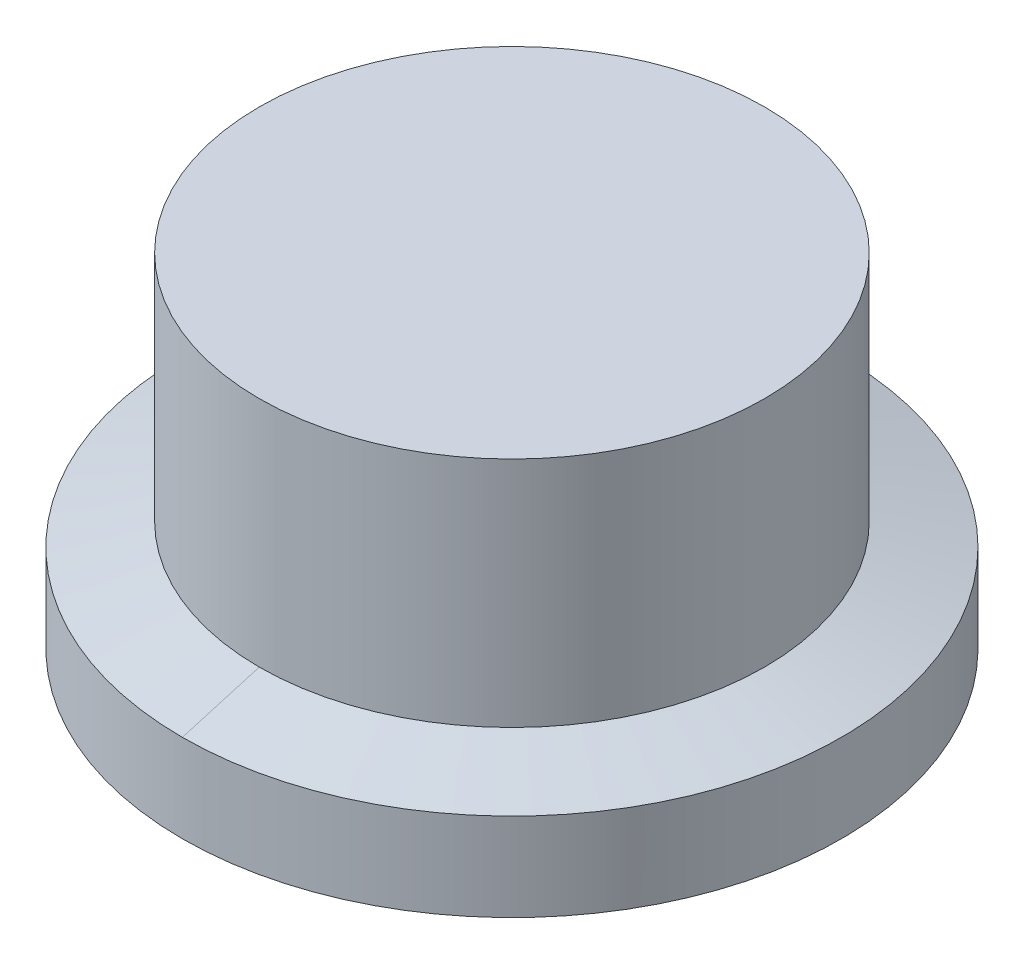
ISO-10303-21;
HEADER;
FILE_DESCRIPTION(('STEP AP214'),'2;1');
FILE_NAME('part.step','',(''),(''),'','','');
FILE_SCHEMA(('AUTOMOTIVE_DESIGN { 1 0 10303 214 1 1 1 1 }'));
ENDSEC;
DATA;
#1=APPLICATION_CONTEXT('core data for automotive mechanical design processes');
#2=APPLICATION_PROTOCOL_DEFINITION('international standard','automotive_design',2000,#1);
#3=PRODUCT_CONTEXT('',#1,'mechanical');
#4=PRODUCT('Part','Part','',(#3));
#5=PRODUCT_RELATED_PRODUCT_CATEGORY('part','',(#4));
#6=PRODUCT_DEFINITION_FORMATION('','',#4);
#7=PRODUCT_DEFINITION_CONTEXT('part definition',#1,'design');
#8=PRODUCT_DEFINITION('design','',#6,#7);
#9=PRODUCT_DEFINITION_SHAPE('','',#8);
#10=(LENGTH_UNIT() NAMED_UNIT(*) SI_UNIT(.MILLI.,.METRE.));
#11=(NAMED_UNIT(*) PLANE_ANGLE_UNIT() SI_UNIT($,.RADIAN.));
#12=(NAMED_UNIT(*) SI_UNIT($,.STERADIAN.) SOLID_ANGLE_UNIT());
#13=UNCERTAINTY_MEASURE_WITH_UNIT(LENGTH_MEASURE(1.E-05),#10,'distance_accuracy_value','');
#14=(GEOMETRIC_REPRESENTATION_CONTEXT(3) GLOBAL_UNCERTAINTY_ASSIGNED_CONTEXT((#13)) GLOBAL_UNIT_ASSIGNED_CONTEXT((#10,
#11,#12)) REPRESENTATION_CONTEXT('',''));
#15=CARTESIAN_POINT('',(0.,0.,0.));
#16=DIRECTION('',(0.,0.,1.));
#17=DIRECTION('',(1.,0.,0.));
#18=AXIS2_PLACEMENT_3D('',#15,#16,#17);
#19=CARTESIAN_POINT('',(0.,13.6,0.));
#20=DIRECTION('',(0.,-1.,0.));
#21=DIRECTION('',(0.,0.,-1.));
#22=AXIS2_PLACEMENT_3D('',#19,#20,#21);
#23=CYLINDRICAL_SURFACE('',#22,3.25);
#24=DIRECTION('',(0.,1.,0.));
#25=VECTOR('',#24,1.);
#26=CARTESIAN_POINT('',(-0.75,7.1,-3.16227766016838));
#27=LINE('',#26,#25);
#28=CARTESIAN_POINT('',(-0.75,7.1,-3.16227766016838));
#29=VERTEX_POINT('',#28);
#30=CARTESIAN_POINT('',(-0.75,13.6,-3.16227766016838));
#31=VERTEX_POINT('',#30);
#32=EDGE_CURVE('E297',#29,#31,#27,.T.);
#33=ORIENTED_EDGE('',*,*,#32,.T.);
#34=CARTESIAN_POINT('',(0.,13.6,0.));
#35=DIRECTION('',(0.,-1.,0.));
#36=DIRECTION('',(0.,0.,-1.));
#37=AXIS2_PLACEMENT_3D('',#34,#35,#36);
#38=CIRCLE('',#37,3.25);
#39=CARTESIAN_POINT('',(-0.75,13.6,3.16227766016838));
#40=VERTEX_POINT('',#39);
#41=EDGE_CURVE('E343',#40,#31,#38,.T.);
#42=ORIENTED_EDGE('',*,*,#41,.F.);
#43=DIRECTION('',(0.,1.,0.));
#44=VECTOR('',#43,1.);
#45=CARTESIAN_POINT('',(-0.75,7.1,3.16227766016838));
#46=LINE('',#45,#44);
#47=CARTESIAN_POINT('',(-0.75,7.1,3.16227766016838));
#48=VERTEX_POINT('',#47);
#49=EDGE_CURVE('E319',#48,#40,#46,.T.);
#50=ORIENTED_EDGE('',*,*,#49,.F.);
#51=CARTESIAN_POINT('',(0.,7.1,0.));
#52=DIRECTION('',(0.,-1.,0.));
#53=DIRECTION('',(0.,0.,-1.));
#54=AXIS2_PLACEMENT_3D('',#51,#52,#53);
#55=CIRCLE('',#54,3.25);
#56=CARTESIAN_POINT('',(0.75,7.1,3.16227766016838));
#57=VERTEX_POINT('',#56);
#58=EDGE_CURVE('E316',#57,#48,#55,.T.);
#59=ORIENTED_EDGE('',*,*,#58,.F.);
#60=DIRECTION('',(0.,1.,0.));
#61=VECTOR('',#60,1.);
#62=CARTESIAN_POINT('',(0.75,7.1,3.16227766016838));
#63=LINE('',#62,#61);
#64=CARTESIAN_POINT('',(0.75,13.6,3.16227766016838));
#65=VERTEX_POINT('',#64);
#66=EDGE_CURVE('E332',#57,#65,#63,.T.);
#67=ORIENTED_EDGE('',*,*,#66,.T.);
#68=CARTESIAN_POINT('',(0.75,13.6,-3.16227766016838));
#69=VERTEX_POINT('',#68);
#70=EDGE_CURVE('E348',#69,#65,#38,.T.);
#71=ORIENTED_EDGE('',*,*,#70,.F.);
#72=DIRECTION('',(0.,1.,0.));
#73=VECTOR('',#72,1.);
#74=CARTESIAN_POINT('',(0.75,7.1,-3.16227766016838));
#75=LINE('',#74,#73);
#76=CARTESIAN_POINT('',(0.75,7.1,-3.16227766016838));
#77=VERTEX_POINT('',#76);
#78=EDGE_CURVE('E294',#77,#69,#75,.T.);
#79=ORIENTED_EDGE('',*,*,#78,.F.);
#80=CARTESIAN_POINT('',(0.,7.1,0.));
#81=DIRECTION('',(0.,-1.,0.));
#82=DIRECTION('',(0.,0.,-1.));
#83=AXIS2_PLACEMENT_3D('',#80,#81,#82);
#84=CIRCLE('',#83,3.25);
#85=EDGE_CURVE('E276',#29,#77,#84,.T.);
#86=ORIENTED_EDGE('',*,*,#85,.F.);
#87=EDGE_LOOP('',(#33,#42,#50,#59,#67,#71,#79,#86));
#88=FACE_BOUND('',#87,.T.);
#89=DIRECTION('',(0.,-1.,0.));
#90=VECTOR('',#89,1.);
#91=CARTESIAN_POINT('',(-3.21130814466628,7.1,0.5));
#92=LINE('',#91,#90);
#93=CARTESIAN_POINT('',(-3.21130814466628,7.1,0.5));
#94=VERTEX_POINT('',#93);
#95=CARTESIAN_POINT('',(-3.21130814466628,1.6,0.5));
#96=VERTEX_POINT('',#95);
#97=EDGE_CURVE('E225',#94,#96,#92,.T.);
#98=ORIENTED_EDGE('',*,*,#97,.F.);
#99=CARTESIAN_POINT('',(0.,7.1,0.));
#100=DIRECTION('',(0.,-1.,0.));
#101=DIRECTION('',(0.,0.,-1.));
#102=AXIS2_PLACEMENT_3D('',#99,#100,#101);
#103=CIRCLE('',#102,3.25);
#104=CARTESIAN_POINT('',(-3.21130814466628,7.1,-0.5));
#105=VERTEX_POINT('',#104);
#106=EDGE_CURVE('E198',#105,#94,#103,.F.);
#107=ORIENTED_EDGE('',*,*,#106,.F.);
#108=DIRECTION('',(0.,-1.,0.));
#109=VECTOR('',#108,1.);
#110=CARTESIAN_POINT('',(-3.21130814466628,7.1,-0.5));
#111=LINE('',#110,#109);
#112=CARTESIAN_POINT('',(-3.21130814466628,1.6,-0.5));
#113=VERTEX_POINT('',#112);
#114=EDGE_CURVE('E229',#105,#113,#111,.T.);
#115=ORIENTED_EDGE('',*,*,#114,.T.);
#116=CARTESIAN_POINT('',(0.,1.6,0.));
#117=DIRECTION('',(0.,-1.,0.));
#118=DIRECTION('',(0.,0.,-1.));
#119=AXIS2_PLACEMENT_3D('',#116,#117,#118);
#120=CIRCLE('',#119,3.25);
#121=CARTESIAN_POINT('',(3.21130814466628,1.6,-0.5));
#122=VERTEX_POINT('',#121);
#123=EDGE_CURVE('E342',#113,#122,#120,.T.);
#124=ORIENTED_EDGE('',*,*,#123,.T.);
#125=DIRECTION('',(0.,-1.,0.));
#126=VECTOR('',#125,1.);
#127=CARTESIAN_POINT('',(3.21130814466628,7.1,-0.5));
#128=LINE('',#127,#126);
#129=CARTESIAN_POINT('',(3.21130814466628,7.1,-0.5));
#130=VERTEX_POINT('',#129);
#131=EDGE_CURVE('E222',#130,#122,#128,.T.);
#132=ORIENTED_EDGE('',*,*,#131,.F.);
#133=CARTESIAN_POINT('',(0.,7.1,0.));
#134=DIRECTION('',(0.,-1.,0.));
#135=DIRECTION('',(0.,0.,-1.));
#136=AXIS2_PLACEMENT_3D('',#133,#134,#135);
#137=CIRCLE('',#136,3.25);
#138=CARTESIAN_POINT('',(3.21130814466628,7.1,0.5));
#139=VERTEX_POINT('',#138);
#140=EDGE_CURVE('E246',#139,#130,#137,.F.);
#141=ORIENTED_EDGE('',*,*,#140,.F.);
#142=DIRECTION('',(0.,-1.,0.));
#143=VECTOR('',#142,1.);
#144=CARTESIAN_POINT('',(3.21130814466628,7.1,0.5));
#145=LINE('',#144,#143);
#146=CARTESIAN_POINT('',(3.21130814466628,1.6,0.5));
#147=VERTEX_POINT('',#146);
#148=EDGE_CURVE('E259',#139,#147,#145,.T.);
#149=ORIENTED_EDGE('',*,*,#148,.T.);
#150=EDGE_CURVE('E352',#147,#96,#120,.T.);
#151=ORIENTED_EDGE('',*,*,#150,.T.);
#152=EDGE_LOOP('',(#98,#107,#115,#124,#132,#141,#149,#151));
#153=FACE_BOUND('',#152,.T.);
#154=ADVANCED_FACE('F41',(#88,#153),#23,.F.);
#155=CARTESIAN_POINT('',(0.,1.6,0.));
#156=DIRECTION('',(0.,1.,0.));
#157=DIRECTION('',(0.,0.,1.));
#158=AXIS2_PLACEMENT_3D('',#155,#156,#157);
#159=CYLINDRICAL_SURFACE('',#158,4.5);
#160=CARTESIAN_POINT('',(0.,13.6,0.));
#161=DIRECTION('',(0.,-1.,0.));
#162=DIRECTION('',(0.,0.,-1.));
#163=AXIS2_PLACEMENT_3D('',#160,#161,#162);
#164=CIRCLE('',#163,4.5);
#165=CARTESIAN_POINT('',(0.,13.6,-4.5));
#166=VERTEX_POINT('',#165);
#167=EDGE_CURVE('E347',#166,#166,#164,.T.);
#168=ORIENTED_EDGE('',*,*,#167,.T.);
#169=EDGE_LOOP('',(#168));
#170=FACE_BOUND('',#169,.T.);
#171=DIRECTION('',(0.,-1.,0.));
#172=VECTOR('',#171,1.);
#173=CARTESIAN_POINT('',(-4.47213595499958,7.1,0.5));
#174=LINE('',#173,#172);
#175=CARTESIAN_POINT('',(-4.47213595499958,7.1,0.5));
#176=VERTEX_POINT('',#175);
#177=CARTESIAN_POINT('',(-4.47213595499958,1.6,0.5));
#178=VERTEX_POINT('',#177);
#179=EDGE_CURVE('E186',#176,#178,#174,.T.);
#180=ORIENTED_EDGE('',*,*,#179,.T.);
#181=CARTESIAN_POINT('',(0.,1.6,0.));
#182=DIRECTION('',(0.,-1.,0.));
#183=DIRECTION('',(0.,0.,-1.));
#184=AXIS2_PLACEMENT_3D('',#181,#182,#183);
#185=CIRCLE('',#184,4.5);
#186=CARTESIAN_POINT('',(4.47213595499958,1.6,0.5));
#187=VERTEX_POINT('',#186);
#188=EDGE_CURVE('E357',#187,#178,#185,.T.);
#189=ORIENTED_EDGE('',*,*,#188,.F.);
#190=DIRECTION('',(0.,-1.,0.));
#191=VECTOR('',#190,1.);
#192=CARTESIAN_POINT('',(4.47213595499958,7.1,0.5));
#193=LINE('',#192,#191);
#194=CARTESIAN_POINT('',(4.47213595499958,7.1,0.5));
#195=VERTEX_POINT('',#194);
#196=EDGE_CURVE('E67',#195,#187,#193,.T.);
#197=ORIENTED_EDGE('',*,*,#196,.F.);
#198=CARTESIAN_POINT('',(0.,7.1,0.));
#199=DIRECTION('',(0.,-1.,0.));
#200=DIRECTION('',(0.,0.,-1.));
#201=AXIS2_PLACEMENT_3D('',#198,#199,#200);
#202=CIRCLE('',#201,4.5);
#203=CARTESIAN_POINT('',(4.47213595499958,7.1,-0.5));
#204=VERTEX_POINT('',#203);
#205=EDGE_CURVE('E238',#204,#195,#202,.T.);
#206=ORIENTED_EDGE('',*,*,#205,.F.);
#207=DIRECTION('',(0.,-1.,0.));
#208=VECTOR('',#207,1.);
#209=CARTESIAN_POINT('',(4.47213595499958,7.1,-0.5));
#210=LINE('',#209,#208);
#211=CARTESIAN_POINT('',(4.47213595499958,1.6,-0.5));
#212=VERTEX_POINT('',#211);
#213=EDGE_CURVE('E250',#204,#212,#210,.T.);
#214=ORIENTED_EDGE('',*,*,#213,.T.);
#215=CARTESIAN_POINT('',(-4.47213595499958,1.6,-0.5));
#216=VERTEX_POINT('',#215);
#217=EDGE_CURVE('E353',#216,#212,#185,.T.);
#218=ORIENTED_EDGE('',*,*,#217,.F.);
#219=DIRECTION('',(0.,-1.,0.));
#220=VECTOR('',#219,1.);
#221=CARTESIAN_POINT('',(-4.47213595499958,7.1,-0.5));
#222=LINE('',#221,#220);
#223=CARTESIAN_POINT('',(-4.47213595499958,7.1,-0.5));
#224=VERTEX_POINT('',#223);
#225=EDGE_CURVE('E59',#224,#216,#222,.T.);
#226=ORIENTED_EDGE('',*,*,#225,.F.);
#227=CARTESIAN_POINT('',(0.,7.1,0.));
#228=DIRECTION('',(0.,-1.,0.));
#229=DIRECTION('',(0.,0.,-1.));
#230=AXIS2_PLACEMENT_3D('',#227,#228,#229);
#231=CIRCLE('',#230,4.5);
#232=EDGE_CURVE('E204',#176,#224,#231,.T.);
#233=ORIENTED_EDGE('',*,*,#232,.F.);
#234=EDGE_LOOP('',(#180,#189,#197,#206,#214,#218,#226,#233));
#235=FACE_BOUND('',#234,.T.);
#236=ADVANCED_FACE('F210',(#170,#235),#159,.T.);
#237=CARTESIAN_POINT('',(0.,1.6,0.));
#238=DIRECTION('',(0.,-1.,0.));
#239=DIRECTION('',(0.,0.,-1.));
#240=AXIS2_PLACEMENT_3D('',#237,#238,#239);
#241=PLANE('',#240);
#242=ORIENTED_EDGE('',*,*,#188,.T.);
#243=DIRECTION('',(1.,0.,0.));
#244=VECTOR('',#243,1.);
#245=CARTESIAN_POINT('',(0.,1.6,0.5));
#246=LINE('',#245,#244);
#247=EDGE_CURVE('E192',#178,#96,#246,.T.);
#248=ORIENTED_EDGE('',*,*,#247,.T.);
#249=ORIENTED_EDGE('',*,*,#150,.F.);
#250=DIRECTION('',(1.,0.,0.));
#251=VECTOR('',#250,1.);
#252=CARTESIAN_POINT('',(0.,1.6,0.5));
#253=LINE('',#252,#251);
#254=EDGE_CURVE('E239',#147,#187,#253,.T.);
#255=ORIENTED_EDGE('',*,*,#254,.T.);
#256=EDGE_LOOP('',(#242,#248,#249,#255));
#257=FACE_BOUND('',#256,.T.);
#258=ADVANCED_FACE('F453',(#257),#241,.T.);
#259=ORIENTED_EDGE('',*,*,#123,.F.);
#260=DIRECTION('',(-1.,0.,0.));
#261=VECTOR('',#260,1.);
#262=CARTESIAN_POINT('',(0.,1.6,-0.5));
#263=LINE('',#262,#261);
#264=EDGE_CURVE('E208',#113,#216,#263,.T.);
#265=ORIENTED_EDGE('',*,*,#264,.T.);
#266=ORIENTED_EDGE('',*,*,#217,.T.);
#267=DIRECTION('',(-1.,0.,0.));
#268=VECTOR('',#267,1.);
#269=CARTESIAN_POINT('',(0.,1.6,-0.5));
#270=LINE('',#269,#268);
#271=EDGE_CURVE('E251',#212,#122,#270,.T.);
#272=ORIENTED_EDGE('',*,*,#271,.T.);
#273=EDGE_LOOP('',(#259,#265,#266,#272));
#274=FACE_BOUND('',#273,.T.);
#275=ADVANCED_FACE('F462',(#274),#241,.T.);
#276=CARTESIAN_POINT('',(0.,13.6,0.));
#277=DIRECTION('',(0.,-1.,0.));
#278=DIRECTION('',(0.,0.,-1.));
#279=AXIS2_PLACEMENT_3D('',#276,#277,#278);
#280=PLANE('',#279);
#281=ORIENTED_EDGE('',*,*,#41,.T.);
#282=DIRECTION('',(0.,0.,-1.));
#283=VECTOR('',#282,1.);
#284=CARTESIAN_POINT('',(-0.75,13.6,0.));
#285=LINE('',#284,#283);
#286=CARTESIAN_POINT('',(-0.75,13.6,-0.5));
#287=VERTEX_POINT('',#286);
#288=EDGE_CURVE('E286',#287,#31,#285,.T.);
#289=ORIENTED_EDGE('',*,*,#288,.F.);
#290=DIRECTION('',(1.,0.,0.));
#291=VECTOR('',#290,1.);
#292=CARTESIAN_POINT('',(0.,13.6,-0.5));
#293=LINE('',#292,#291);
#294=CARTESIAN_POINT('',(0.75,13.6,-0.5));
#295=VERTEX_POINT('',#294);
#296=EDGE_CURVE('E228',#287,#295,#293,.T.);
#297=ORIENTED_EDGE('',*,*,#296,.T.);
#298=DIRECTION('',(0.,0.,1.));
#299=VECTOR('',#298,1.);
#300=CARTESIAN_POINT('',(0.75,13.6,0.));
#301=LINE('',#300,#299);
#302=EDGE_CURVE('E273',#69,#295,#301,.T.);
#303=ORIENTED_EDGE('',*,*,#302,.F.);
#304=ORIENTED_EDGE('',*,*,#70,.T.);
#305=DIRECTION('',(0.,0.,1.));
#306=VECTOR('',#305,1.);
#307=CARTESIAN_POINT('',(0.75,13.6,0.));
#308=LINE('',#307,#306);
#309=CARTESIAN_POINT('',(0.75,13.6,0.5));
#310=VERTEX_POINT('',#309);
#311=EDGE_CURVE('E310',#310,#65,#308,.T.);
#312=ORIENTED_EDGE('',*,*,#311,.F.);
#313=DIRECTION('',(1.,0.,0.));
#314=VECTOR('',#313,1.);
#315=CARTESIAN_POINT('',(0.,13.6,0.5));
#316=LINE('',#315,#314);
#317=CARTESIAN_POINT('',(-0.75,13.6,0.5));
#318=VERTEX_POINT('',#317);
#319=EDGE_CURVE('E323',#318,#310,#316,.T.);
#320=ORIENTED_EDGE('',*,*,#319,.F.);
#321=DIRECTION('',(0.,0.,-1.));
#322=VECTOR('',#321,1.);
#323=CARTESIAN_POINT('',(-0.75,13.6,0.));
#324=LINE('',#323,#322);
#325=EDGE_CURVE('E304',#40,#318,#324,.T.);
#326=ORIENTED_EDGE('',*,*,#325,.F.);
#327=EDGE_LOOP('',(#281,#289,#297,#303,#304,#312,#320,#326));
#328=FACE_BOUND('',#327,.T.);
#329=ADVANCED_FACE('F459',(#328),#280,.T.);
#330=CARTESIAN_POINT('',(0.,5.6,0.));
#331=DIRECTION('',(0.,-1.,0.));
#332=DIRECTION('',(0.,0.,-1.));
#333=AXIS2_PLACEMENT_3D('',#330,#331,#332);
#334=CONICAL_SURFACE('',#333,9.5,1.2877005414954);
#335=CARTESIAN_POINT('',(0.,5.01818181818182,0.));
#336=DIRECTION('',(0.,-1.,0.));
#337=DIRECTION('',(0.,0.,-1.));
#338=AXIS2_PLACEMENT_3D('',#335,#336,#337);
#339=CIRCLE('',#338,11.5);
#340=CARTESIAN_POINT('',(-11.5,5.01818181818182,0.));
#341=VERTEX_POINT('',#340);
#342=CARTESIAN_POINT('',(0.,5.01818181818182,11.5));
#343=VERTEX_POINT('',#342);
#344=EDGE_CURVE('E370',#341,#343,#339,.T.);
#345=ORIENTED_EDGE('',*,*,#344,.T.);
#346=DIRECTION('',(0.,-0.279329540830131,0.960195296603575));
#347=VECTOR('',#346,1.);
#348=CARTESIAN_POINT('',(0.,4.,15.));
#349=LINE('',#348,#347);
#350=CARTESIAN_POINT('',(0.,4.,15.));
#351=VERTEX_POINT('',#350);
#352=EDGE_CURVE('E398',#343,#351,#349,.T.);
#353=ORIENTED_EDGE('',*,*,#352,.T.);
#354=CARTESIAN_POINT('',(0.,4.,0.));
#355=DIRECTION('',(0.,1.,0.));
#356=DIRECTION('',(0.,0.,1.));
#357=AXIS2_PLACEMENT_3D('',#354,#355,#356);
#358=CIRCLE('',#357,15.);
#359=CARTESIAN_POINT('',(-15.,4.,0.));
#360=VERTEX_POINT('',#359);
#361=EDGE_CURVE('E11',#351,#360,#358,.T.);
#362=ORIENTED_EDGE('',*,*,#361,.T.);
#363=DIRECTION('',(-0.960195296603575,-0.279329540830131,0.));
#364=VECTOR('',#363,1.);
#365=CARTESIAN_POINT('',(-15.,4.,0.));
#366=LINE('',#365,#364);
#367=EDGE_CURVE('E388',#341,#360,#366,.T.);
#368=ORIENTED_EDGE('',*,*,#367,.F.);
#369=EDGE_LOOP('',(#345,#353,#362,#368));
#370=FACE_BOUND('',#369,.T.);
#371=ADVANCED_FACE('F482',(#370),#334,.T.);
#372=CARTESIAN_POINT('',(0.,5.6,0.));
#373=DIRECTION('',(0.,-1.,0.));
#374=DIRECTION('',(0.,0.,-1.));
#375=AXIS2_PLACEMENT_3D('',#372,#373,#374);
#376=CONICAL_SURFACE('',#375,9.5,1.2877005414954);
#377=CARTESIAN_POINT('',(0.,5.01818181818182,0.));
#378=DIRECTION('',(0.,-1.,0.));
#379=DIRECTION('',(0.,0.,-1.));
#380=AXIS2_PLACEMENT_3D('',#377,#378,#379);
#381=CIRCLE('',#380,11.5);
#382=EDGE_CURVE('E369',#343,#341,#381,.T.);
#383=ORIENTED_EDGE('',*,*,#382,.T.);
#384=ORIENTED_EDGE('',*,*,#367,.T.);
#385=CARTESIAN_POINT('',(0.,4.,0.));
#386=DIRECTION('',(0.,-1.,0.));
#387=DIRECTION('',(0.,0.,1.));
#388=AXIS2_PLACEMENT_3D('',#385,#386,#387);
#389=CIRCLE('',#388,15.);
#390=EDGE_CURVE('E394',#351,#360,#389,.T.);
#391=ORIENTED_EDGE('',*,*,#390,.F.);
#392=ORIENTED_EDGE('',*,*,#352,.F.);
#393=EDGE_LOOP('',(#383,#384,#391,#392));
#394=FACE_BOUND('',#393,.T.);
#395=ADVANCED_FACE('F484',(#394),#376,.T.);
#396=CARTESIAN_POINT('',(0.,4.,0.));
#397=DIRECTION('',(0.,-1.,0.));
#398=DIRECTION('',(0.,0.,-1.));
#399=AXIS2_PLACEMENT_3D('',#396,#397,#398);
#400=CYLINDRICAL_SURFACE('',#399,15.);
#401=ORIENTED_EDGE('',*,*,#361,.F.);
#402=ORIENTED_EDGE('',*,*,#390,.T.);
#403=EDGE_LOOP('',(#401,#402));
#404=FACE_BOUND('',#403,.T.);
#405=CARTESIAN_POINT('',(0.,0.,0.));
#406=DIRECTION('',(0.,1.,0.));
#407=DIRECTION('',(0.,0.,1.));
#408=AXIS2_PLACEMENT_3D('',#405,#406,#407);
#409=CIRCLE('',#408,15.);
#410=CARTESIAN_POINT('',(0.,0.,15.));
#411=VERTEX_POINT('',#410);
#412=EDGE_CURVE('E51',#411,#411,#409,.T.);
#413=ORIENTED_EDGE('',*,*,#412,.T.);
#414=EDGE_LOOP('',(#413));
#415=FACE_BOUND('',#414,.T.);
#416=ADVANCED_FACE('F43',(#404,#415),#400,.T.);
#417=CARTESIAN_POINT('',(0.,0.,0.));
#418=DIRECTION('',(0.,1.,0.));
#419=DIRECTION('',(0.,0.,1.));
#420=AXIS2_PLACEMENT_3D('',#417,#418,#419);
#421=PLANE('',#420);
#422=CARTESIAN_POINT('',(0.,0.,0.));
#423=DIRECTION('',(0.,1.,0.));
#424=DIRECTION('',(0.,0.,1.));
#425=AXIS2_PLACEMENT_3D('',#422,#423,#424);
#426=CIRCLE('',#425,13.5);
#427=CARTESIAN_POINT('',(0.,0.,13.5));
#428=VERTEX_POINT('',#427);
#429=EDGE_CURVE('E403',#428,#428,#426,.T.);
#430=ORIENTED_EDGE('',*,*,#429,.T.);
#431=EDGE_LOOP('',(#430));
#432=FACE_BOUND('',#431,.T.);
#433=ORIENTED_EDGE('',*,*,#412,.F.);
#434=EDGE_LOOP('',(#433));
#435=FACE_BOUND('',#434,.T.);
#436=ADVANCED_FACE('F436',(#432,#435),#421,.F.);
#437=CARTESIAN_POINT('',(0.,0.,0.));
#438=DIRECTION('',(0.,1.,0.));
#439=DIRECTION('',(0.,0.,1.));
#440=AXIS2_PLACEMENT_3D('',#437,#438,#439);
#441=CYLINDRICAL_SURFACE('',#440,13.5);
#442=ORIENTED_EDGE('',*,*,#429,.F.);
#443=EDGE_LOOP('',(#442));
#444=FACE_BOUND('',#443,.T.);
#445=CARTESIAN_POINT('',(0.,4.,0.));
#446=DIRECTION('',(0.,1.,0.));
#447=DIRECTION('',(0.,0.,1.));
#448=AXIS2_PLACEMENT_3D('',#445,#446,#447);
#449=CIRCLE('',#448,13.5);
#450=CARTESIAN_POINT('',(0.,4.,13.5));
#451=VERTEX_POINT('',#450);
#452=CARTESIAN_POINT('',(-13.5,4.,0.));
#453=VERTEX_POINT('',#452);
#454=EDGE_CURVE('E407',#451,#453,#449,.T.);
#455=ORIENTED_EDGE('',*,*,#454,.T.);
#456=EDGE_CURVE('E393',#453,#451,#449,.T.);
#457=ORIENTED_EDGE('',*,*,#456,.T.);
#458=EDGE_LOOP('',(#455,#457));
#459=FACE_BOUND('',#458,.T.);
#460=ADVANCED_FACE('F433',(#444,#459),#441,.F.);
#461=CARTESIAN_POINT('',(0.,4.,15.));
#462=DIRECTION('',(0.,1.,0.));
#463=DIRECTION('',(0.,0.,1.));
#464=AXIS2_PLACEMENT_3D('',#461,#462,#463);
#465=PLANE('',#464);
#466=ORIENTED_EDGE('',*,*,#456,.F.);
#467=DIRECTION('',(1.,0.,0.));
#468=VECTOR('',#467,1.);
#469=CARTESIAN_POINT('',(-15.,4.,0.));
#470=LINE('',#469,#468);
#471=CARTESIAN_POINT('',(-9.5,4.,0.));
#472=VERTEX_POINT('',#471);
#473=EDGE_CURVE('E374',#453,#472,#470,.T.);
#474=ORIENTED_EDGE('',*,*,#473,.T.);
#475=CARTESIAN_POINT('',(0.,4.,0.));
#476=DIRECTION('',(0.,-1.,0.));
#477=DIRECTION('',(0.,0.,1.));
#478=AXIS2_PLACEMENT_3D('',#475,#476,#477);
#479=CIRCLE('',#478,9.5);
#480=CARTESIAN_POINT('',(0.,4.,9.5));
#481=VERTEX_POINT('',#480);
#482=EDGE_CURVE('E389',#481,#472,#479,.T.);
#483=ORIENTED_EDGE('',*,*,#482,.F.);
#484=DIRECTION('',(0.,0.,-1.));
#485=VECTOR('',#484,1.);
#486=CARTESIAN_POINT('',(0.,4.,15.));
#487=LINE('',#486,#485);
#488=EDGE_CURVE('E380',#451,#481,#487,.T.);
#489=ORIENTED_EDGE('',*,*,#488,.F.);
#490=EDGE_LOOP('',(#466,#474,#483,#489));
#491=FACE_BOUND('',#490,.T.);
#492=ADVANCED_FACE('F425',(#491),#465,.F.);
#493=CARTESIAN_POINT('',(-15.,4.,0.));
#494=DIRECTION('',(0.,1.,0.));
#495=DIRECTION('',(0.,0.,1.));
#496=AXIS2_PLACEMENT_3D('',#493,#494,#495);
#497=PLANE('',#496);
#498=ORIENTED_EDGE('',*,*,#454,.F.);
#499=ORIENTED_EDGE('',*,*,#488,.T.);
#500=CARTESIAN_POINT('',(0.,4.,0.));
#501=DIRECTION('',(0.,-1.,0.));
#502=DIRECTION('',(-1.,0.,0.));
#503=AXIS2_PLACEMENT_3D('',#500,#501,#502);
#504=CIRCLE('',#503,9.5);
#505=EDGE_CURVE('E384',#472,#481,#504,.T.);
#506=ORIENTED_EDGE('',*,*,#505,.F.);
#507=ORIENTED_EDGE('',*,*,#473,.F.);
#508=EDGE_LOOP('',(#498,#499,#506,#507));
#509=FACE_BOUND('',#508,.T.);
#510=ADVANCED_FACE('F431',(#509),#497,.F.);
#511=CARTESIAN_POINT('',(0.,4.,0.));
#512=DIRECTION('',(0.,-1.,0.));
#513=DIRECTION('',(0.,0.,-1.));
#514=AXIS2_PLACEMENT_3D('',#511,#512,#513);
#515=CYLINDRICAL_SURFACE('',#514,9.5);
#516=DIRECTION('',(0.,1.,0.));
#517=VECTOR('',#516,1.);
#518=CARTESIAN_POINT('',(0.,5.6,9.5));
#519=LINE('',#518,#517);
#520=CARTESIAN_POINT('',(0.,5.6,9.5));
#521=VERTEX_POINT('',#520);
#522=EDGE_CURVE('E383',#481,#521,#519,.T.);
#523=ORIENTED_EDGE('',*,*,#522,.T.);
#524=ORIENTED_EDGE('',*,*,#522,.F.);
#525=ORIENTED_EDGE('',*,*,#482,.T.);
#526=DIRECTION('',(0.,1.,0.));
#527=VECTOR('',#526,1.);
#528=CARTESIAN_POINT('',(-9.5,5.6,0.));
#529=LINE('',#528,#527);
#530=CARTESIAN_POINT('',(-9.5,5.6,0.));
#531=VERTEX_POINT('',#530);
#532=EDGE_CURVE('E379',#472,#531,#529,.T.);
#533=ORIENTED_EDGE('',*,*,#532,.T.);
#534=ORIENTED_EDGE('',*,*,#532,.F.);
#535=ORIENTED_EDGE('',*,*,#505,.T.);
#536=EDGE_LOOP('',(#523,#524,#525,#533,#534,#535));
#537=FACE_BOUND('',#536,.T.);
#538=CARTESIAN_POINT('',(0.,13.6,0.));
#539=DIRECTION('',(0.,-1.,0.));
#540=DIRECTION('',(0.,0.,-1.));
#541=AXIS2_PLACEMENT_3D('',#538,#539,#540);
#542=CIRCLE('',#541,9.5);
#543=CARTESIAN_POINT('',(0.,13.6,-9.5));
#544=VERTEX_POINT('',#543);
#545=EDGE_CURVE('E361',#544,#544,#542,.T.);
#546=ORIENTED_EDGE('',*,*,#545,.F.);
#547=EDGE_LOOP('',(#546));
#548=FACE_BOUND('',#547,.T.);
#549=ADVANCED_FACE('F420',(#537,#548),#515,.F.);
#550=CARTESIAN_POINT('',(0.,-0.00200000000000027,0.));
#551=DIRECTION('',(0.,1.,0.));
#552=DIRECTION('',(0.,0.,1.));
#553=AXIS2_PLACEMENT_3D('',#550,#551,#552);
#554=CYLINDRICAL_SURFACE('',#553,11.5);
#555=ORIENTED_EDGE('',*,*,#344,.F.);
#556=ORIENTED_EDGE('',*,*,#382,.F.);
#557=EDGE_LOOP('',(#555,#556));
#558=FACE_BOUND('',#557,.T.);
#559=CARTESIAN_POINT('',(0.,15.6,0.));
#560=DIRECTION('',(0.,1.,0.));
#561=DIRECTION('',(0.,0.,1.));
#562=AXIS2_PLACEMENT_3D('',#559,#560,#561);
#563=CIRCLE('',#562,11.5);
#564=CARTESIAN_POINT('',(0.,15.6,11.5));
#565=VERTEX_POINT('',#564);
#566=EDGE_CURVE('E365',#565,#565,#563,.T.);
#567=ORIENTED_EDGE('',*,*,#566,.F.);
#568=EDGE_LOOP('',(#567));
#569=FACE_BOUND('',#568,.T.);
#570=ADVANCED_FACE('F473',(#558,#569),#554,.T.);
#571=CARTESIAN_POINT('',(0.,15.6,0.));
#572=DIRECTION('',(0.,1.,0.));
#573=DIRECTION('',(0.,0.,1.));
#574=AXIS2_PLACEMENT_3D('',#571,#572,#573);
#575=PLANE('',#574);
#576=ORIENTED_EDGE('',*,*,#566,.T.);
#577=EDGE_LOOP('',(#576));
#578=FACE_BOUND('',#577,.T.);
#579=ADVANCED_FACE('F469',(#578),#575,.T.);
#580=CARTESIAN_POINT('',(0.,13.6,0.));
#581=DIRECTION('',(0.,-1.,0.));
#582=DIRECTION('',(0.,0.,-1.));
#583=AXIS2_PLACEMENT_3D('',#580,#581,#582);
#584=PLANE('',#583);
#585=ORIENTED_EDGE('',*,*,#167,.F.);
#586=EDGE_LOOP('',(#585));
#587=FACE_BOUND('',#586,.T.);
#588=ORIENTED_EDGE('',*,*,#545,.T.);
#589=EDGE_LOOP('',(#588));
#590=FACE_BOUND('',#589,.T.);
#591=ADVANCED_FACE('F465',(#587,#590),#584,.T.);
#592=CARTESIAN_POINT('',(-0.75,7.1,0.));
#593=DIRECTION('',(1.,0.,0.));
#594=DIRECTION('',(0.,0.,-1.));
#595=AXIS2_PLACEMENT_3D('',#592,#593,#594);
#596=PLANE('',#595);
#597=ORIENTED_EDGE('',*,*,#325,.T.);
#598=DIRECTION('',(0.,1.,0.));
#599=VECTOR('',#598,1.);
#600=CARTESIAN_POINT('',(-0.75,7.1,0.5));
#601=LINE('',#600,#599);
#602=CARTESIAN_POINT('',(-0.75,7.1,0.5));
#603=VERTEX_POINT('',#602);
#604=EDGE_CURVE('E339',#603,#318,#601,.T.);
#605=ORIENTED_EDGE('',*,*,#604,.F.);
#606=DIRECTION('',(0.,0.,-1.));
#607=VECTOR('',#606,1.);
#608=CARTESIAN_POINT('',(-0.75,7.1,0.));
#609=LINE('',#608,#607);
#610=EDGE_CURVE('E305',#48,#603,#609,.T.);
#611=ORIENTED_EDGE('',*,*,#610,.F.);
#612=ORIENTED_EDGE('',*,*,#49,.T.);
#613=EDGE_LOOP('',(#597,#605,#611,#612));
#614=FACE_BOUND('',#613,.T.);
#615=ADVANCED_FACE('F468',(#614),#596,.F.);
#616=CARTESIAN_POINT('',(0.,7.1,0.5));
#617=DIRECTION('',(0.,0.,1.));
#618=DIRECTION('',(1.,0.,0.));
#619=AXIS2_PLACEMENT_3D('',#616,#617,#618);
#620=PLANE('',#619);
#621=ORIENTED_EDGE('',*,*,#319,.T.);
#622=DIRECTION('',(0.,1.,0.));
#623=VECTOR('',#622,1.);
#624=CARTESIAN_POINT('',(0.75,7.1,0.5));
#625=LINE('',#624,#623);
#626=CARTESIAN_POINT('',(0.75,7.1,0.5));
#627=VERTEX_POINT('',#626);
#628=EDGE_CURVE('E336',#627,#310,#625,.T.);
#629=ORIENTED_EDGE('',*,*,#628,.F.);
#630=DIRECTION('',(1.,0.,0.));
#631=VECTOR('',#630,1.);
#632=CARTESIAN_POINT('',(0.,7.1,0.5));
#633=LINE('',#632,#631);
#634=EDGE_CURVE('E309',#603,#627,#633,.T.);
#635=ORIENTED_EDGE('',*,*,#634,.F.);
#636=ORIENTED_EDGE('',*,*,#604,.T.);
#637=EDGE_LOOP('',(#621,#629,#635,#636));
#638=FACE_BOUND('',#637,.T.);
#639=ADVANCED_FACE('F570',(#638),#620,.F.);
#640=CARTESIAN_POINT('',(0.75,7.1,0.));
#641=DIRECTION('',(-1.,0.,0.));
#642=DIRECTION('',(0.,0.,1.));
#643=AXIS2_PLACEMENT_3D('',#640,#641,#642);
#644=PLANE('',#643);
#645=ORIENTED_EDGE('',*,*,#311,.T.);
#646=ORIENTED_EDGE('',*,*,#66,.F.);
#647=DIRECTION('',(0.,0.,1.));
#648=VECTOR('',#647,1.);
#649=CARTESIAN_POINT('',(0.75,7.1,0.));
#650=LINE('',#649,#648);
#651=EDGE_CURVE('E313',#627,#57,#650,.T.);
#652=ORIENTED_EDGE('',*,*,#651,.F.);
#653=ORIENTED_EDGE('',*,*,#628,.T.);
#654=EDGE_LOOP('',(#645,#646,#652,#653));
#655=FACE_BOUND('',#654,.T.);
#656=ADVANCED_FACE('F577',(#655),#644,.F.);
#657=CARTESIAN_POINT('',(0.,7.1,0.));
#658=DIRECTION('',(0.,-1.,0.));
#659=DIRECTION('',(0.,0.,-1.));
#660=AXIS2_PLACEMENT_3D('',#657,#658,#659);
#661=PLANE('',#660);
#662=ORIENTED_EDGE('',*,*,#610,.T.);
#663=ORIENTED_EDGE('',*,*,#634,.T.);
#664=ORIENTED_EDGE('',*,*,#651,.T.);
#665=ORIENTED_EDGE('',*,*,#58,.T.);
#666=EDGE_LOOP('',(#662,#663,#664,#665));
#667=FACE_BOUND('',#666,.T.);
#668=ADVANCED_FACE('F585',(#667),#661,.T.);
#669=CARTESIAN_POINT('',(0.,7.1,-0.5));
#670=DIRECTION('',(0.,0.,1.));
#671=DIRECTION('',(1.,0.,0.));
#672=AXIS2_PLACEMENT_3D('',#669,#670,#671);
#673=PLANE('',#672);
#674=ORIENTED_EDGE('',*,*,#296,.F.);
#675=DIRECTION('',(0.,1.,0.));
#676=VECTOR('',#675,1.);
#677=CARTESIAN_POINT('',(-0.75,7.1,-0.5));
#678=LINE('',#677,#676);
#679=CARTESIAN_POINT('',(-0.75,7.1,-0.5));
#680=VERTEX_POINT('',#679);
#681=EDGE_CURVE('E301',#680,#287,#678,.T.);
#682=ORIENTED_EDGE('',*,*,#681,.F.);
#683=DIRECTION('',(1.,0.,0.));
#684=VECTOR('',#683,1.);
#685=CARTESIAN_POINT('',(0.,7.1,-0.5));
#686=LINE('',#685,#684);
#687=CARTESIAN_POINT('',(0.75,7.1,-0.5));
#688=VERTEX_POINT('',#687);
#689=EDGE_CURVE('E268',#680,#688,#686,.T.);
#690=ORIENTED_EDGE('',*,*,#689,.T.);
#691=DIRECTION('',(0.,1.,0.));
#692=VECTOR('',#691,1.);
#693=CARTESIAN_POINT('',(0.75,7.1,-0.5));
#694=LINE('',#693,#692);
#695=EDGE_CURVE('E282',#688,#295,#694,.T.);
#696=ORIENTED_EDGE('',*,*,#695,.T.);
#697=EDGE_LOOP('',(#674,#682,#690,#696));
#698=FACE_BOUND('',#697,.T.);
#699=ADVANCED_FACE('F593',(#698),#673,.T.);
#700=CARTESIAN_POINT('',(-0.75,7.1,0.));
#701=DIRECTION('',(1.,0.,0.));
#702=DIRECTION('',(0.,0.,-1.));
#703=AXIS2_PLACEMENT_3D('',#700,#701,#702);
#704=PLANE('',#703);
#705=ORIENTED_EDGE('',*,*,#288,.T.);
#706=ORIENTED_EDGE('',*,*,#32,.F.);
#707=DIRECTION('',(0.,0.,-1.));
#708=VECTOR('',#707,1.);
#709=CARTESIAN_POINT('',(-0.75,7.1,0.));
#710=LINE('',#709,#708);
#711=EDGE_CURVE('E272',#680,#29,#710,.T.);
#712=ORIENTED_EDGE('',*,*,#711,.F.);
#713=ORIENTED_EDGE('',*,*,#681,.T.);
#714=EDGE_LOOP('',(#705,#706,#712,#713));
#715=FACE_BOUND('',#714,.T.);
#716=ADVANCED_FACE('F601',(#715),#704,.F.);
#717=CARTESIAN_POINT('',(0.75,7.1,0.));
#718=DIRECTION('',(-1.,0.,0.));
#719=DIRECTION('',(0.,0.,1.));
#720=AXIS2_PLACEMENT_3D('',#717,#718,#719);
#721=PLANE('',#720);
#722=ORIENTED_EDGE('',*,*,#302,.T.);
#723=ORIENTED_EDGE('',*,*,#695,.F.);
#724=DIRECTION('',(0.,0.,1.));
#725=VECTOR('',#724,1.);
#726=CARTESIAN_POINT('',(0.75,7.1,0.));
#727=LINE('',#726,#725);
#728=EDGE_CURVE('E279',#77,#688,#727,.T.);
#729=ORIENTED_EDGE('',*,*,#728,.F.);
#730=ORIENTED_EDGE('',*,*,#78,.T.);
#731=EDGE_LOOP('',(#722,#723,#729,#730));
#732=FACE_BOUND('',#731,.T.);
#733=ADVANCED_FACE('F609',(#732),#721,.F.);
#734=CARTESIAN_POINT('',(0.,7.1,0.));
#735=DIRECTION('',(0.,-1.,0.));
#736=DIRECTION('',(0.,0.,-1.));
#737=AXIS2_PLACEMENT_3D('',#734,#735,#736);
#738=PLANE('',#737);
#739=ORIENTED_EDGE('',*,*,#689,.F.);
#740=ORIENTED_EDGE('',*,*,#711,.T.);
#741=ORIENTED_EDGE('',*,*,#85,.T.);
#742=ORIENTED_EDGE('',*,*,#728,.T.);
#743=EDGE_LOOP('',(#739,#740,#741,#742));
#744=FACE_BOUND('',#743,.T.);
#745=ADVANCED_FACE('F617',(#744),#738,.T.);
#746=CARTESIAN_POINT('',(0.,7.1,-0.5));
#747=DIRECTION('',(0.,0.,1.));
#748=DIRECTION('',(1.,0.,0.));
#749=AXIS2_PLACEMENT_3D('',#746,#747,#748);
#750=PLANE('',#749);
#751=ORIENTED_EDGE('',*,*,#271,.F.);
#752=ORIENTED_EDGE('',*,*,#213,.F.);
#753=DIRECTION('',(-1.,0.,0.));
#754=VECTOR('',#753,1.);
#755=CARTESIAN_POINT('',(0.,7.1,-0.5));
#756=LINE('',#755,#754);
#757=EDGE_CURVE('E235',#204,#130,#756,.T.);
#758=ORIENTED_EDGE('',*,*,#757,.T.);
#759=ORIENTED_EDGE('',*,*,#131,.T.);
#760=EDGE_LOOP('',(#751,#752,#758,#759));
#761=FACE_BOUND('',#760,.T.);
#762=ADVANCED_FACE('F625',(#761),#750,.T.);
#763=CARTESIAN_POINT('',(0.,7.1,0.5));
#764=DIRECTION('',(0.,0.,-1.));
#765=DIRECTION('',(-1.,0.,0.));
#766=AXIS2_PLACEMENT_3D('',#763,#764,#765);
#767=PLANE('',#766);
#768=ORIENTED_EDGE('',*,*,#254,.F.);
#769=ORIENTED_EDGE('',*,*,#148,.F.);
#770=DIRECTION('',(1.,0.,0.));
#771=VECTOR('',#770,1.);
#772=CARTESIAN_POINT('',(0.,7.1,0.5));
#773=LINE('',#772,#771);
#774=EDGE_CURVE('E243',#139,#195,#773,.T.);
#775=ORIENTED_EDGE('',*,*,#774,.T.);
#776=ORIENTED_EDGE('',*,*,#196,.T.);
#777=EDGE_LOOP('',(#768,#769,#775,#776));
#778=FACE_BOUND('',#777,.T.);
#779=ADVANCED_FACE('F633',(#778),#767,.T.);
#780=CARTESIAN_POINT('',(0.,7.1,0.));
#781=DIRECTION('',(0.,-1.,0.));
#782=DIRECTION('',(0.,0.,-1.));
#783=AXIS2_PLACEMENT_3D('',#780,#781,#782);
#784=PLANE('',#783);
#785=ORIENTED_EDGE('',*,*,#757,.F.);
#786=ORIENTED_EDGE('',*,*,#205,.T.);
#787=ORIENTED_EDGE('',*,*,#774,.F.);
#788=ORIENTED_EDGE('',*,*,#140,.T.);
#789=EDGE_LOOP('',(#785,#786,#787,#788));
#790=FACE_BOUND('',#789,.T.);
#791=ADVANCED_FACE('F642',(#790),#784,.T.);
#792=CARTESIAN_POINT('',(0.,7.1,0.5));
#793=DIRECTION('',(0.,0.,-1.));
#794=DIRECTION('',(-1.,0.,0.));
#795=AXIS2_PLACEMENT_3D('',#792,#793,#794);
#796=PLANE('',#795);
#797=ORIENTED_EDGE('',*,*,#247,.F.);
#798=ORIENTED_EDGE('',*,*,#179,.F.);
#799=DIRECTION('',(1.,0.,0.));
#800=VECTOR('',#799,1.);
#801=CARTESIAN_POINT('',(0.,7.1,0.5));
#802=LINE('',#801,#800);
#803=EDGE_CURVE('E189',#176,#94,#802,.T.);
#804=ORIENTED_EDGE('',*,*,#803,.T.);
#805=ORIENTED_EDGE('',*,*,#97,.T.);
#806=EDGE_LOOP('',(#797,#798,#804,#805));
#807=FACE_BOUND('',#806,.T.);
#808=ADVANCED_FACE('F188',(#807),#796,.T.);
#809=CARTESIAN_POINT('',(0.,7.1,-0.5));
#810=DIRECTION('',(0.,0.,1.));
#811=DIRECTION('',(1.,0.,0.));
#812=AXIS2_PLACEMENT_3D('',#809,#810,#811);
#813=PLANE('',#812);
#814=ORIENTED_EDGE('',*,*,#264,.F.);
#815=ORIENTED_EDGE('',*,*,#114,.F.);
#816=DIRECTION('',(-1.,0.,0.));
#817=VECTOR('',#816,1.);
#818=CARTESIAN_POINT('',(0.,7.1,-0.5));
#819=LINE('',#818,#817);
#820=EDGE_CURVE('E213',#105,#224,#819,.T.);
#821=ORIENTED_EDGE('',*,*,#820,.T.);
#822=ORIENTED_EDGE('',*,*,#225,.T.);
#823=EDGE_LOOP('',(#814,#815,#821,#822));
#824=FACE_BOUND('',#823,.T.);
#825=ADVANCED_FACE('F656',(#824),#813,.T.);
#826=CARTESIAN_POINT('',(0.,7.1,0.));
#827=DIRECTION('',(0.,-1.,0.));
#828=DIRECTION('',(0.,0.,-1.));
#829=AXIS2_PLACEMENT_3D('',#826,#827,#828);
#830=PLANE('',#829);
#831=ORIENTED_EDGE('',*,*,#803,.F.);
#832=ORIENTED_EDGE('',*,*,#232,.T.);
#833=ORIENTED_EDGE('',*,*,#820,.F.);
#834=ORIENTED_EDGE('',*,*,#106,.T.);
#835=EDGE_LOOP('',(#831,#832,#833,#834));
#836=FACE_BOUND('',#835,.T.);
#837=ADVANCED_FACE('F202',(#836),#830,.T.);
#838=CLOSED_SHELL('',(#154,#236,#258,#275,#329,#371,#395,#416,#436,#460,#492,#510,#549,#570,
#579,#591,#615,#639,#656,#668,#699,#716,#733,#745,#762,#779,#791,#808,#825,#837));
#839=MANIFOLD_SOLID_BREP('B2',#838);
#840=ADVANCED_BREP_SHAPE_REPRESENTATION('',(#18,#839),#14);
#841=SHAPE_DEFINITION_REPRESENTATION(#9,#840);
ENDSEC;
END-ISO-10303-21;
